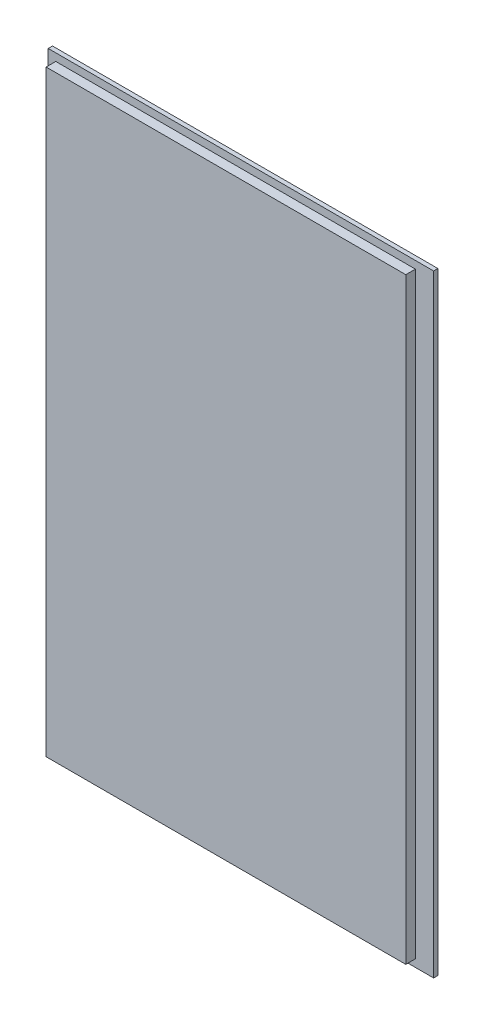
ISO-10303-21;
HEADER;
FILE_DESCRIPTION(('STEP AP214'),'2;1');
FILE_NAME('part.step','',(''),(''),'','','');
FILE_SCHEMA(('AUTOMOTIVE_DESIGN { 1 0 10303 214 1 1 1 1 }'));
ENDSEC;
DATA;
#1=APPLICATION_CONTEXT('core data for automotive mechanical design processes');
#2=APPLICATION_PROTOCOL_DEFINITION('international standard','automotive_design',2000,#1);
#3=PRODUCT_CONTEXT('',#1,'mechanical');
#4=PRODUCT('Part','Part','',(#3));
#5=PRODUCT_RELATED_PRODUCT_CATEGORY('part','',(#4));
#6=PRODUCT_DEFINITION_FORMATION('','',#4);
#7=PRODUCT_DEFINITION_CONTEXT('part definition',#1,'design');
#8=PRODUCT_DEFINITION('design','',#6,#7);
#9=PRODUCT_DEFINITION_SHAPE('','',#8);
#10=(LENGTH_UNIT() NAMED_UNIT(*) SI_UNIT(.MILLI.,.METRE.));
#11=(NAMED_UNIT(*) PLANE_ANGLE_UNIT() SI_UNIT($,.RADIAN.));
#12=(NAMED_UNIT(*) SI_UNIT($,.STERADIAN.) SOLID_ANGLE_UNIT());
#13=UNCERTAINTY_MEASURE_WITH_UNIT(LENGTH_MEASURE(1.E-05),#10,'distance_accuracy_value','');
#14=(GEOMETRIC_REPRESENTATION_CONTEXT(3) GLOBAL_UNCERTAINTY_ASSIGNED_CONTEXT((#13)) GLOBAL_UNIT_ASSIGNED_CONTEXT((#10,
#11,#12)) REPRESENTATION_CONTEXT('',''));
#15=CARTESIAN_POINT('',(0.,0.,0.));
#16=DIRECTION('',(0.,0.,1.));
#17=DIRECTION('',(1.,0.,0.));
#18=AXIS2_PLACEMENT_3D('',#15,#16,#17);
#19=CARTESIAN_POINT('',(0.,0.,0.8));
#20=DIRECTION('',(0.,0.,-1.));
#21=DIRECTION('',(-1.,0.,0.));
#22=AXIS2_PLACEMENT_3D('',#19,#20,#21);
#23=PLANE('',#22);
#24=DIRECTION('',(0.,-1.,0.));
#25=VECTOR('',#24,1.);
#26=CARTESIAN_POINT('',(0.,0.,0.8));
#27=LINE('',#26,#25);
#28=CARTESIAN_POINT('',(0.,114.4,0.8));
#29=VERTEX_POINT('',#28);
#30=CARTESIAN_POINT('',(0.,0.,0.8));
#31=VERTEX_POINT('',#30);
#32=EDGE_CURVE('E127',#29,#31,#27,.T.);
#33=ORIENTED_EDGE('',*,*,#32,.T.);
#34=DIRECTION('',(1.,0.,0.));
#35=VECTOR('',#34,1.);
#36=CARTESIAN_POINT('',(0.,0.,0.8));
#37=LINE('',#36,#35);
#38=CARTESIAN_POINT('',(72.,0.,0.8));
#39=VERTEX_POINT('',#38);
#40=EDGE_CURVE('E130',#31,#39,#37,.T.);
#41=ORIENTED_EDGE('',*,*,#40,.T.);
#42=DIRECTION('',(0.,1.,0.));
#43=VECTOR('',#42,1.);
#44=CARTESIAN_POINT('',(72.,0.,0.8));
#45=LINE('',#44,#43);
#46=CARTESIAN_POINT('',(72.,114.4,0.8));
#47=VERTEX_POINT('',#46);
#48=EDGE_CURVE('E133',#39,#47,#45,.T.);
#49=ORIENTED_EDGE('',*,*,#48,.T.);
#50=DIRECTION('',(-1.,0.,0.));
#51=VECTOR('',#50,1.);
#52=CARTESIAN_POINT('',(0.,114.4,0.8));
#53=LINE('',#52,#51);
#54=EDGE_CURVE('E135',#47,#29,#53,.T.);
#55=ORIENTED_EDGE('',*,*,#54,.T.);
#56=EDGE_LOOP('',(#33,#41,#49,#55));
#57=FACE_BOUND('',#56,.T.);
#58=DIRECTION('',(0.,-1.,0.));
#59=VECTOR('',#58,1.);
#60=CARTESIAN_POINT('',(1.4,113.,0.8));
#61=LINE('',#60,#59);
#62=CARTESIAN_POINT('',(1.4,113.,0.8));
#63=VERTEX_POINT('',#62);
#64=CARTESIAN_POINT('',(1.40000000000002,1.4,0.8));
#65=VERTEX_POINT('',#64);
#66=EDGE_CURVE('E48',#63,#65,#61,.T.);
#67=ORIENTED_EDGE('',*,*,#66,.F.);
#68=DIRECTION('',(-1.,0.,0.));
#69=VECTOR('',#68,1.);
#70=CARTESIAN_POINT('',(1.4,113.,0.8));
#71=LINE('',#70,#69);
#72=CARTESIAN_POINT('',(68.6,113.,0.8));
#73=VERTEX_POINT('',#72);
#74=EDGE_CURVE('E52',#73,#63,#71,.T.);
#75=ORIENTED_EDGE('',*,*,#74,.F.);
#76=DIRECTION('',(0.,1.,0.));
#77=VECTOR('',#76,1.);
#78=CARTESIAN_POINT('',(68.6,1.4,0.8));
#79=LINE('',#78,#77);
#80=CARTESIAN_POINT('',(68.6,1.4,0.8));
#81=VERTEX_POINT('',#80);
#82=EDGE_CURVE('E260',#81,#73,#79,.T.);
#83=ORIENTED_EDGE('',*,*,#82,.F.);
#84=DIRECTION('',(1.,0.,0.));
#85=VECTOR('',#84,1.);
#86=CARTESIAN_POINT('',(1.40000000000002,1.4,0.8));
#87=LINE('',#86,#85);
#88=EDGE_CURVE('E266',#65,#81,#87,.T.);
#89=ORIENTED_EDGE('',*,*,#88,.F.);
#90=EDGE_LOOP('',(#67,#75,#83,#89));
#91=FACE_BOUND('',#90,.T.);
#92=ADVANCED_FACE('F33',(#57,#91),#23,.F.);
#93=CARTESIAN_POINT('',(0.,0.,0.8));
#94=DIRECTION('',(1.,0.,0.));
#95=DIRECTION('',(0.,0.,-1.));
#96=AXIS2_PLACEMENT_3D('',#93,#94,#95);
#97=PLANE('',#96);
#98=DIRECTION('',(0.,-1.,0.));
#99=VECTOR('',#98,1.);
#100=CARTESIAN_POINT('',(0.,0.,0.));
#101=LINE('',#100,#99);
#102=CARTESIAN_POINT('',(0.,114.4,0.));
#103=VERTEX_POINT('',#102);
#104=CARTESIAN_POINT('',(0.,0.,0.));
#105=VERTEX_POINT('',#104);
#106=EDGE_CURVE('E118',#103,#105,#101,.T.);
#107=ORIENTED_EDGE('',*,*,#106,.T.);
#108=DIRECTION('',(0.,0.,-1.));
#109=VECTOR('',#108,1.);
#110=CARTESIAN_POINT('',(0.,0.,0.8));
#111=LINE('',#110,#109);
#112=EDGE_CURVE('E11',#31,#105,#111,.T.);
#113=ORIENTED_EDGE('',*,*,#112,.F.);
#114=ORIENTED_EDGE('',*,*,#32,.F.);
#115=DIRECTION('',(0.,0.,-1.));
#116=VECTOR('',#115,1.);
#117=CARTESIAN_POINT('',(0.,114.4,0.8));
#118=LINE('',#117,#116);
#119=EDGE_CURVE('E136',#29,#103,#118,.T.);
#120=ORIENTED_EDGE('',*,*,#119,.T.);
#121=EDGE_LOOP('',(#107,#113,#114,#120));
#122=FACE_BOUND('',#121,.T.);
#123=ADVANCED_FACE('F35',(#122),#97,.F.);
#124=CARTESIAN_POINT('',(0.,0.,0.8));
#125=DIRECTION('',(0.,1.,0.));
#126=DIRECTION('',(0.,0.,1.));
#127=AXIS2_PLACEMENT_3D('',#124,#125,#126);
#128=PLANE('',#127);
#129=DIRECTION('',(1.,0.,0.));
#130=VECTOR('',#129,1.);
#131=CARTESIAN_POINT('',(0.,0.,0.));
#132=LINE('',#131,#130);
#133=CARTESIAN_POINT('',(72.,0.,0.));
#134=VERTEX_POINT('',#133);
#135=EDGE_CURVE('E121',#105,#134,#132,.T.);
#136=ORIENTED_EDGE('',*,*,#135,.T.);
#137=DIRECTION('',(0.,0.,-1.));
#138=VECTOR('',#137,1.);
#139=CARTESIAN_POINT('',(72.,0.,0.8));
#140=LINE('',#139,#138);
#141=EDGE_CURVE('E41',#39,#134,#140,.T.);
#142=ORIENTED_EDGE('',*,*,#141,.F.);
#143=ORIENTED_EDGE('',*,*,#40,.F.);
#144=ORIENTED_EDGE('',*,*,#112,.T.);
#145=EDGE_LOOP('',(#136,#142,#143,#144));
#146=FACE_BOUND('',#145,.T.);
#147=ADVANCED_FACE('F166',(#146),#128,.F.);
#148=CARTESIAN_POINT('',(72.,0.,0.8));
#149=DIRECTION('',(-1.,0.,0.));
#150=DIRECTION('',(0.,0.,1.));
#151=AXIS2_PLACEMENT_3D('',#148,#149,#150);
#152=PLANE('',#151);
#153=DIRECTION('',(0.,1.,0.));
#154=VECTOR('',#153,1.);
#155=CARTESIAN_POINT('',(72.,0.,0.));
#156=LINE('',#155,#154);
#157=CARTESIAN_POINT('',(72.,114.4,0.));
#158=VERTEX_POINT('',#157);
#159=EDGE_CURVE('E139',#134,#158,#156,.T.);
#160=ORIENTED_EDGE('',*,*,#159,.T.);
#161=DIRECTION('',(0.,0.,-1.));
#162=VECTOR('',#161,1.);
#163=CARTESIAN_POINT('',(72.,114.4,0.8));
#164=LINE('',#163,#162);
#165=EDGE_CURVE('E144',#47,#158,#164,.T.);
#166=ORIENTED_EDGE('',*,*,#165,.F.);
#167=ORIENTED_EDGE('',*,*,#48,.F.);
#168=ORIENTED_EDGE('',*,*,#141,.T.);
#169=EDGE_LOOP('',(#160,#166,#167,#168));
#170=FACE_BOUND('',#169,.T.);
#171=ADVANCED_FACE('F151',(#170),#152,.F.);
#172=CARTESIAN_POINT('',(0.,114.4,0.8));
#173=DIRECTION('',(0.,-1.,0.));
#174=DIRECTION('',(0.,0.,-1.));
#175=AXIS2_PLACEMENT_3D('',#172,#173,#174);
#176=PLANE('',#175);
#177=DIRECTION('',(-1.,0.,0.));
#178=VECTOR('',#177,1.);
#179=CARTESIAN_POINT('',(0.,114.4,0.));
#180=LINE('',#179,#178);
#181=EDGE_CURVE('E131',#158,#103,#180,.T.);
#182=ORIENTED_EDGE('',*,*,#181,.T.);
#183=ORIENTED_EDGE('',*,*,#119,.F.);
#184=ORIENTED_EDGE('',*,*,#54,.F.);
#185=ORIENTED_EDGE('',*,*,#165,.T.);
#186=EDGE_LOOP('',(#182,#183,#184,#185));
#187=FACE_BOUND('',#186,.T.);
#188=ADVANCED_FACE('F160',(#187),#176,.F.);
#189=CARTESIAN_POINT('',(0.,0.,0.));
#190=DIRECTION('',(0.,0.,-1.));
#191=DIRECTION('',(-1.,0.,0.));
#192=AXIS2_PLACEMENT_3D('',#189,#190,#191);
#193=PLANE('',#192);
#194=ORIENTED_EDGE('',*,*,#106,.F.);
#195=ORIENTED_EDGE('',*,*,#181,.F.);
#196=ORIENTED_EDGE('',*,*,#159,.F.);
#197=ORIENTED_EDGE('',*,*,#135,.F.);
#198=EDGE_LOOP('',(#194,#195,#196,#197));
#199=FACE_BOUND('',#198,.T.);
#200=ADVANCED_FACE('F157',(#199),#193,.T.);
#201=CARTESIAN_POINT('',(1.4,113.,2.6));
#202=DIRECTION('',(1.,0.,0.));
#203=DIRECTION('',(0.,1.,0.));
#204=AXIS2_PLACEMENT_3D('',#201,#202,#203);
#205=PLANE('',#204);
#206=ORIENTED_EDGE('',*,*,#66,.T.);
#207=DIRECTION('',(0.,0.,-1.));
#208=VECTOR('',#207,1.);
#209=CARTESIAN_POINT('',(1.40000000000002,1.4,2.6));
#210=LINE('',#209,#208);
#211=CARTESIAN_POINT('',(1.40000000000002,1.4,2.6));
#212=VERTEX_POINT('',#211);
#213=EDGE_CURVE('E101',#212,#65,#210,.T.);
#214=ORIENTED_EDGE('',*,*,#213,.F.);
#215=DIRECTION('',(0.,-1.,0.));
#216=VECTOR('',#215,1.);
#217=CARTESIAN_POINT('',(1.4,113.,2.6));
#218=LINE('',#217,#216);
#219=CARTESIAN_POINT('',(1.4,113.,2.6));
#220=VERTEX_POINT('',#219);
#221=EDGE_CURVE('E107',#220,#212,#218,.T.);
#222=ORIENTED_EDGE('',*,*,#221,.F.);
#223=DIRECTION('',(0.,0.,-1.));
#224=VECTOR('',#223,1.);
#225=CARTESIAN_POINT('',(1.4,113.,2.6));
#226=LINE('',#225,#224);
#227=EDGE_CURVE('E258',#220,#63,#226,.T.);
#228=ORIENTED_EDGE('',*,*,#227,.T.);
#229=EDGE_LOOP('',(#206,#214,#222,#228));
#230=FACE_BOUND('',#229,.T.);
#231=ADVANCED_FACE('F117',(#230),#205,.F.);
#232=CARTESIAN_POINT('',(1.40000000000002,1.4,2.6));
#233=DIRECTION('',(0.,1.,0.));
#234=DIRECTION('',(-1.,0.,0.));
#235=AXIS2_PLACEMENT_3D('',#232,#233,#234);
#236=PLANE('',#235);
#237=ORIENTED_EDGE('',*,*,#88,.T.);
#238=DIRECTION('',(0.,0.,-1.));
#239=VECTOR('',#238,1.);
#240=CARTESIAN_POINT('',(68.6,1.4,2.6));
#241=LINE('',#240,#239);
#242=CARTESIAN_POINT('',(68.6,1.4,2.6));
#243=VERTEX_POINT('',#242);
#244=EDGE_CURVE('E103',#243,#81,#241,.T.);
#245=ORIENTED_EDGE('',*,*,#244,.F.);
#246=DIRECTION('',(1.,0.,0.));
#247=VECTOR('',#246,1.);
#248=CARTESIAN_POINT('',(1.40000000000002,1.4,2.6));
#249=LINE('',#248,#247);
#250=EDGE_CURVE('E96',#212,#243,#249,.T.);
#251=ORIENTED_EDGE('',*,*,#250,.F.);
#252=ORIENTED_EDGE('',*,*,#213,.T.);
#253=EDGE_LOOP('',(#237,#245,#251,#252));
#254=FACE_BOUND('',#253,.T.);
#255=ADVANCED_FACE('F99',(#254),#236,.F.);
#256=CARTESIAN_POINT('',(68.6,1.4,2.6));
#257=DIRECTION('',(-1.,0.,0.));
#258=DIRECTION('',(0.,0.,1.));
#259=AXIS2_PLACEMENT_3D('',#256,#257,#258);
#260=PLANE('',#259);
#261=ORIENTED_EDGE('',*,*,#82,.T.);
#262=DIRECTION('',(0.,0.,-1.));
#263=VECTOR('',#262,1.);
#264=CARTESIAN_POINT('',(68.6,113.,2.6));
#265=LINE('',#264,#263);
#266=CARTESIAN_POINT('',(68.6,113.,2.6));
#267=VERTEX_POINT('',#266);
#268=EDGE_CURVE('E123',#267,#73,#265,.T.);
#269=ORIENTED_EDGE('',*,*,#268,.F.);
#270=DIRECTION('',(0.,1.,0.));
#271=VECTOR('',#270,1.);
#272=CARTESIAN_POINT('',(68.6,1.4,2.6));
#273=LINE('',#272,#271);
#274=EDGE_CURVE('E106',#243,#267,#273,.T.);
#275=ORIENTED_EDGE('',*,*,#274,.F.);
#276=ORIENTED_EDGE('',*,*,#244,.T.);
#277=EDGE_LOOP('',(#261,#269,#275,#276));
#278=FACE_BOUND('',#277,.T.);
#279=ADVANCED_FACE('F202',(#278),#260,.F.);
#280=CARTESIAN_POINT('',(1.4,113.,2.6));
#281=DIRECTION('',(0.,-1.,0.));
#282=DIRECTION('',(0.,0.,-1.));
#283=AXIS2_PLACEMENT_3D('',#280,#281,#282);
#284=PLANE('',#283);
#285=ORIENTED_EDGE('',*,*,#74,.T.);
#286=ORIENTED_EDGE('',*,*,#227,.F.);
#287=DIRECTION('',(-1.,0.,0.));
#288=VECTOR('',#287,1.);
#289=CARTESIAN_POINT('',(1.4,113.,2.6));
#290=LINE('',#289,#288);
#291=EDGE_CURVE('E112',#267,#220,#290,.T.);
#292=ORIENTED_EDGE('',*,*,#291,.F.);
#293=ORIENTED_EDGE('',*,*,#268,.T.);
#294=EDGE_LOOP('',(#285,#286,#292,#293));
#295=FACE_BOUND('',#294,.T.);
#296=ADVANCED_FACE('F208',(#295),#284,.F.);
#297=CARTESIAN_POINT('',(0.,0.,2.6));
#298=DIRECTION('',(0.,0.,1.));
#299=DIRECTION('',(1.,0.,0.));
#300=AXIS2_PLACEMENT_3D('',#297,#298,#299);
#301=PLANE('',#300);
#302=ORIENTED_EDGE('',*,*,#221,.T.);
#303=ORIENTED_EDGE('',*,*,#250,.T.);
#304=ORIENTED_EDGE('',*,*,#274,.T.);
#305=ORIENTED_EDGE('',*,*,#291,.T.);
#306=EDGE_LOOP('',(#302,#303,#304,#305));
#307=FACE_BOUND('',#306,.T.);
#308=ADVANCED_FACE('F110',(#307),#301,.T.);
#309=CLOSED_SHELL('',(#92,#123,#147,#171,#188,#200,#231,#255,#279,#296,#308));
#310=MANIFOLD_SOLID_BREP('B2',#309);
#311=ADVANCED_BREP_SHAPE_REPRESENTATION('',(#18,#310),#14);
#312=SHAPE_DEFINITION_REPRESENTATION(#9,#311);
ENDSEC;
END-ISO-10303-21;
